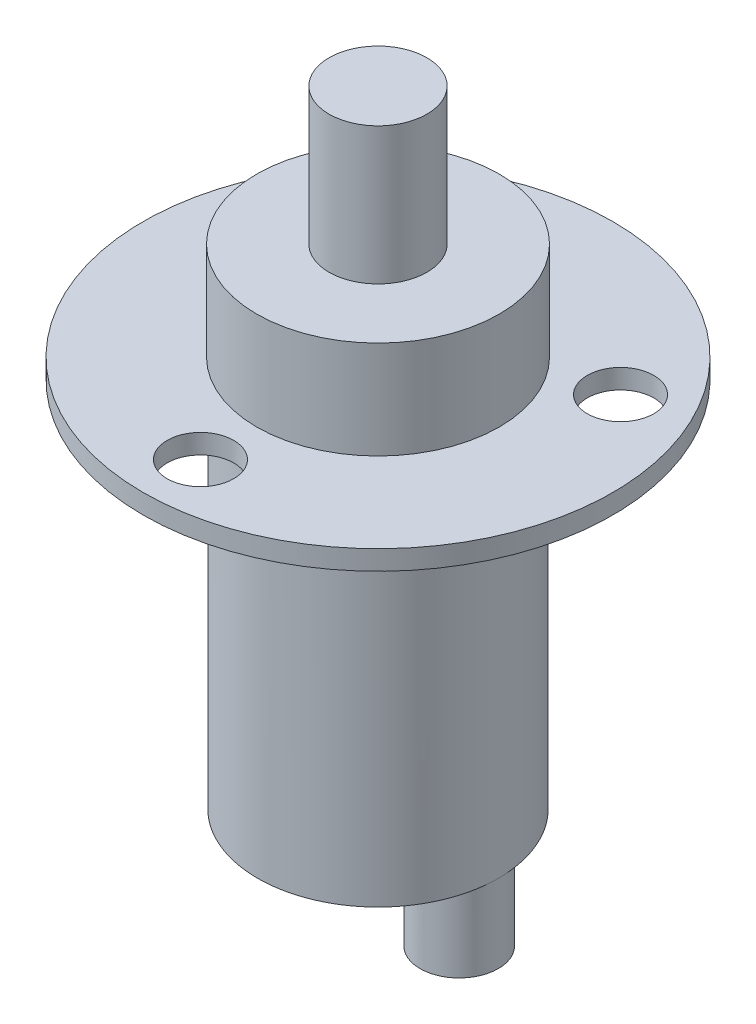
ISO-10303-21;
HEADER;
FILE_DESCRIPTION(('STEP AP214'),'2;1');
FILE_NAME('part.step','',(''),(''),'','','');
FILE_SCHEMA(('AUTOMOTIVE_DESIGN { 1 0 10303 214 1 1 1 1 }'));
ENDSEC;
DATA;
#1=APPLICATION_CONTEXT('core data for automotive mechanical design processes');
#2=APPLICATION_PROTOCOL_DEFINITION('international standard','automotive_design',2000,#1);
#3=PRODUCT_CONTEXT('',#1,'mechanical');
#4=PRODUCT('Part','Part','',(#3));
#5=PRODUCT_RELATED_PRODUCT_CATEGORY('part','',(#4));
#6=PRODUCT_DEFINITION_FORMATION('','',#4);
#7=PRODUCT_DEFINITION_CONTEXT('part definition',#1,'design');
#8=PRODUCT_DEFINITION('design','',#6,#7);
#9=PRODUCT_DEFINITION_SHAPE('','',#8);
#10=(LENGTH_UNIT() NAMED_UNIT(*) SI_UNIT(.MILLI.,.METRE.));
#11=(NAMED_UNIT(*) PLANE_ANGLE_UNIT() SI_UNIT($,.RADIAN.));
#12=(NAMED_UNIT(*) SI_UNIT($,.STERADIAN.) SOLID_ANGLE_UNIT());
#13=UNCERTAINTY_MEASURE_WITH_UNIT(LENGTH_MEASURE(1.E-05),#10,'distance_accuracy_value','');
#14=(GEOMETRIC_REPRESENTATION_CONTEXT(3) GLOBAL_UNCERTAINTY_ASSIGNED_CONTEXT((#13)) GLOBAL_UNIT_ASSIGNED_CONTEXT((#10,
#11,#12)) REPRESENTATION_CONTEXT('',''));
#15=CARTESIAN_POINT('',(0.,0.,0.));
#16=DIRECTION('',(0.,0.,1.));
#17=DIRECTION('',(1.,0.,0.));
#18=AXIS2_PLACEMENT_3D('',#15,#16,#17);
#19=CARTESIAN_POINT('',(0.,19.,0.));
#20=DIRECTION('',(0.,-1.,0.));
#21=DIRECTION('',(0.,0.,-1.));
#22=AXIS2_PLACEMENT_3D('',#19,#20,#21);
#23=CYLINDRICAL_SURFACE('',#22,6.15);
#24=CARTESIAN_POINT('',(0.,19.,0.));
#25=DIRECTION('',(0.,1.,0.));
#26=DIRECTION('',(0.,0.,1.));
#27=AXIS2_PLACEMENT_3D('',#24,#25,#26);
#28=CIRCLE('',#27,6.15);
#29=CARTESIAN_POINT('',(0.,19.,6.15));
#30=VERTEX_POINT('',#29);
#31=EDGE_CURVE('E53',#30,#30,#28,.T.);
#32=ORIENTED_EDGE('',*,*,#31,.F.);
#33=EDGE_LOOP('',(#32));
#34=FACE_BOUND('',#33,.T.);
#35=CARTESIAN_POINT('',(0.,0.,0.));
#36=DIRECTION('',(0.,1.,0.));
#37=DIRECTION('',(0.,0.,1.));
#38=AXIS2_PLACEMENT_3D('',#35,#36,#37);
#39=CIRCLE('',#38,6.15);
#40=CARTESIAN_POINT('',(-6.15,0.,0.));
#41=VERTEX_POINT('',#40);
#42=CARTESIAN_POINT('',(6.15,0.,0.));
#43=VERTEX_POINT('',#42);
#44=EDGE_CURVE('E36',#41,#43,#39,.T.);
#45=ORIENTED_EDGE('',*,*,#44,.T.);
#46=EDGE_CURVE('E48',#43,#41,#39,.T.);
#47=ORIENTED_EDGE('',*,*,#46,.T.);
#48=EDGE_LOOP('',(#45,#47));
#49=FACE_BOUND('',#48,.T.);
#50=ADVANCED_FACE('F33',(#34,#49),#23,.T.);
#51=CARTESIAN_POINT('',(0.,0.,0.));
#52=DIRECTION('',(0.,1.,0.));
#53=DIRECTION('',(0.,0.,1.));
#54=AXIS2_PLACEMENT_3D('',#51,#52,#53);
#55=PLANE('',#54);
#56=ORIENTED_EDGE('',*,*,#46,.F.);
#57=CARTESIAN_POINT('',(4.15,0.,0.));
#58=DIRECTION('',(0.,-1.,0.));
#59=DIRECTION('',(0.,0.,-1.));
#60=AXIS2_PLACEMENT_3D('',#57,#58,#59);
#61=CIRCLE('',#60,2.);
#62=EDGE_CURVE('E56',#43,#43,#61,.T.);
#63=ORIENTED_EDGE('',*,*,#62,.F.);
#64=ORIENTED_EDGE('',*,*,#44,.F.);
#65=CARTESIAN_POINT('',(-4.15,0.,0.));
#66=DIRECTION('',(0.,-1.,0.));
#67=DIRECTION('',(0.,0.,-1.));
#68=AXIS2_PLACEMENT_3D('',#65,#66,#67);
#69=CIRCLE('',#68,2.);
#70=EDGE_CURVE('E58',#41,#41,#69,.T.);
#71=ORIENTED_EDGE('',*,*,#70,.F.);
#72=EDGE_LOOP('',(#56,#63,#64,#71));
#73=FACE_BOUND('',#72,.T.);
#74=ADVANCED_FACE('F54',(#73),#55,.F.);
#75=CARTESIAN_POINT('',(0.,20.,0.));
#76=DIRECTION('',(0.,-1.,0.));
#77=DIRECTION('',(0.,0.,-1.));
#78=AXIS2_PLACEMENT_3D('',#75,#76,#77);
#79=CYLINDRICAL_SURFACE('',#78,12.);
#80=CARTESIAN_POINT('',(0.,20.,0.));
#81=DIRECTION('',(0.,1.,0.));
#82=DIRECTION('',(0.,0.,1.));
#83=AXIS2_PLACEMENT_3D('',#80,#81,#82);
#84=CIRCLE('',#83,12.);
#85=CARTESIAN_POINT('',(0.,20.,12.));
#86=VERTEX_POINT('',#85);
#87=EDGE_CURVE('E59',#86,#86,#84,.T.);
#88=ORIENTED_EDGE('',*,*,#87,.F.);
#89=EDGE_LOOP('',(#88));
#90=FACE_BOUND('',#89,.T.);
#91=CARTESIAN_POINT('',(0.,19.,0.));
#92=DIRECTION('',(0.,1.,0.));
#93=DIRECTION('',(0.,0.,1.));
#94=AXIS2_PLACEMENT_3D('',#91,#92,#93);
#95=CIRCLE('',#94,12.);
#96=CARTESIAN_POINT('',(0.,19.,12.));
#97=VERTEX_POINT('',#96);
#98=EDGE_CURVE('E61',#97,#97,#95,.T.);
#99=ORIENTED_EDGE('',*,*,#98,.T.);
#100=EDGE_LOOP('',(#99));
#101=FACE_BOUND('',#100,.T.);
#102=ADVANCED_FACE('F81',(#90,#101),#79,.T.);
#103=CARTESIAN_POINT('',(0.,20.,0.));
#104=DIRECTION('',(0.,1.,0.));
#105=DIRECTION('',(0.,0.,1.));
#106=AXIS2_PLACEMENT_3D('',#103,#104,#105);
#107=PLANE('',#106);
#108=CARTESIAN_POINT('',(0.,20.,9.075));
#109=DIRECTION('',(0.,1.,0.));
#110=DIRECTION('',(0.,0.,1.));
#111=AXIS2_PLACEMENT_3D('',#108,#109,#110);
#112=CIRCLE('',#111,1.7);
#113=CARTESIAN_POINT('',(0.,20.,10.775));
#114=VERTEX_POINT('',#113);
#115=EDGE_CURVE('E208',#114,#114,#112,.T.);
#116=ORIENTED_EDGE('',*,*,#115,.F.);
#117=EDGE_LOOP('',(#116));
#118=FACE_BOUND('',#117,.T.);
#119=CARTESIAN_POINT('',(7.85918053934436,20.,-4.53749999999967));
#120=DIRECTION('',(0.,1.,0.));
#121=DIRECTION('',(0.,0.,1.));
#122=AXIS2_PLACEMENT_3D('',#119,#120,#121);
#123=CIRCLE('',#122,1.7000000000005);
#124=CARTESIAN_POINT('',(7.85918053934436,20.,-2.83749999999917));
#125=VERTEX_POINT('',#124);
#126=EDGE_CURVE('E212',#125,#125,#123,.T.);
#127=ORIENTED_EDGE('',*,*,#126,.F.);
#128=EDGE_LOOP('',(#127));
#129=FACE_BOUND('',#128,.T.);
#130=CARTESIAN_POINT('',(-7.8591805393432,20.,-4.53750000000034));
#131=DIRECTION('',(0.,1.,0.));
#132=DIRECTION('',(0.,0.,1.));
#133=AXIS2_PLACEMENT_3D('',#130,#131,#132);
#134=CIRCLE('',#133,1.70000000000073);
#135=CARTESIAN_POINT('',(-7.8591805393432,20.,-2.8374999999996));
#136=VERTEX_POINT('',#135);
#137=EDGE_CURVE('E215',#136,#136,#134,.T.);
#138=ORIENTED_EDGE('',*,*,#137,.F.);
#139=EDGE_LOOP('',(#138));
#140=FACE_BOUND('',#139,.T.);
#141=CARTESIAN_POINT('',(0.,20.,0.));
#142=DIRECTION('',(0.,1.,0.));
#143=DIRECTION('',(0.,0.,1.));
#144=AXIS2_PLACEMENT_3D('',#141,#142,#143);
#145=CIRCLE('',#144,6.2);
#146=CARTESIAN_POINT('',(0.,20.,6.2));
#147=VERTEX_POINT('',#146);
#148=EDGE_CURVE('E41',#147,#147,#145,.T.);
#149=ORIENTED_EDGE('',*,*,#148,.F.);
#150=EDGE_LOOP('',(#149));
#151=FACE_BOUND('',#150,.T.);
#152=ORIENTED_EDGE('',*,*,#87,.T.);
#153=EDGE_LOOP('',(#152));
#154=FACE_BOUND('',#153,.T.);
#155=ADVANCED_FACE('F78',(#118,#129,#140,#151,#154),#107,.T.);
#156=CARTESIAN_POINT('',(0.,19.,0.));
#157=DIRECTION('',(0.,1.,0.));
#158=DIRECTION('',(0.,0.,1.));
#159=AXIS2_PLACEMENT_3D('',#156,#157,#158);
#160=PLANE('',#159);
#161=CARTESIAN_POINT('',(0.,19.,9.075));
#162=DIRECTION('',(0.,-1.,0.));
#163=DIRECTION('',(0.,0.,-1.));
#164=AXIS2_PLACEMENT_3D('',#161,#162,#163);
#165=CIRCLE('',#164,1.7);
#166=CARTESIAN_POINT('',(0.,19.,7.375));
#167=VERTEX_POINT('',#166);
#168=EDGE_CURVE('E218',#167,#167,#165,.T.);
#169=ORIENTED_EDGE('',*,*,#168,.F.);
#170=EDGE_LOOP('',(#169));
#171=FACE_BOUND('',#170,.T.);
#172=CARTESIAN_POINT('',(7.85918053934436,19.,-4.53749999999967));
#173=DIRECTION('',(0.,-1.,0.));
#174=DIRECTION('',(0.,0.,-1.));
#175=AXIS2_PLACEMENT_3D('',#172,#173,#174);
#176=CIRCLE('',#175,1.7000000000005);
#177=CARTESIAN_POINT('',(7.85918053934436,19.,-6.23750000000017));
#178=VERTEX_POINT('',#177);
#179=EDGE_CURVE('E222',#178,#178,#176,.T.);
#180=ORIENTED_EDGE('',*,*,#179,.F.);
#181=EDGE_LOOP('',(#180));
#182=FACE_BOUND('',#181,.T.);
#183=CARTESIAN_POINT('',(-7.8591805393432,19.,-4.53750000000034));
#184=DIRECTION('',(0.,-1.,0.));
#185=DIRECTION('',(0.,0.,-1.));
#186=AXIS2_PLACEMENT_3D('',#183,#184,#185);
#187=CIRCLE('',#186,1.70000000000073);
#188=CARTESIAN_POINT('',(-7.8591805393432,19.,-6.23750000000107));
#189=VERTEX_POINT('',#188);
#190=EDGE_CURVE('E219',#189,#189,#187,.T.);
#191=ORIENTED_EDGE('',*,*,#190,.F.);
#192=EDGE_LOOP('',(#191));
#193=FACE_BOUND('',#192,.T.);
#194=ORIENTED_EDGE('',*,*,#31,.T.);
#195=EDGE_LOOP('',(#194));
#196=FACE_BOUND('',#195,.T.);
#197=ORIENTED_EDGE('',*,*,#98,.F.);
#198=EDGE_LOOP('',(#197));
#199=FACE_BOUND('',#198,.T.);
#200=ADVANCED_FACE('F80',(#171,#182,#193,#196,#199),#160,.F.);
#201=CARTESIAN_POINT('',(0.,25.,0.));
#202=DIRECTION('',(0.,-1.,0.));
#203=DIRECTION('',(0.,0.,-1.));
#204=AXIS2_PLACEMENT_3D('',#201,#202,#203);
#205=CYLINDRICAL_SURFACE('',#204,6.2);
#206=CARTESIAN_POINT('',(0.,25.,0.));
#207=DIRECTION('',(0.,1.,0.));
#208=DIRECTION('',(0.,0.,1.));
#209=AXIS2_PLACEMENT_3D('',#206,#207,#208);
#210=CIRCLE('',#209,6.2);
#211=CARTESIAN_POINT('',(0.,25.,6.2));
#212=VERTEX_POINT('',#211);
#213=EDGE_CURVE('E66',#212,#212,#210,.T.);
#214=ORIENTED_EDGE('',*,*,#213,.F.);
#215=EDGE_LOOP('',(#214));
#216=FACE_BOUND('',#215,.T.);
#217=ORIENTED_EDGE('',*,*,#148,.T.);
#218=EDGE_LOOP('',(#217));
#219=FACE_BOUND('',#218,.T.);
#220=ADVANCED_FACE('F76',(#216,#219),#205,.T.);
#221=CARTESIAN_POINT('',(0.,25.,0.));
#222=DIRECTION('',(0.,1.,0.));
#223=DIRECTION('',(0.,0.,1.));
#224=AXIS2_PLACEMENT_3D('',#221,#222,#223);
#225=PLANE('',#224);
#226=CARTESIAN_POINT('',(0.,25.,0.));
#227=DIRECTION('',(0.,1.,0.));
#228=DIRECTION('',(0.,0.,1.));
#229=AXIS2_PLACEMENT_3D('',#226,#227,#228);
#230=CIRCLE('',#229,2.5);
#231=CARTESIAN_POINT('',(0.,25.,2.5));
#232=VERTEX_POINT('',#231);
#233=EDGE_CURVE('E11',#232,#232,#230,.T.);
#234=ORIENTED_EDGE('',*,*,#233,.F.);
#235=EDGE_LOOP('',(#234));
#236=FACE_BOUND('',#235,.T.);
#237=ORIENTED_EDGE('',*,*,#213,.T.);
#238=EDGE_LOOP('',(#237));
#239=FACE_BOUND('',#238,.T.);
#240=ADVANCED_FACE('F186',(#236,#239),#225,.T.);
#241=CARTESIAN_POINT('',(0.,32.,0.));
#242=DIRECTION('',(0.,-1.,0.));
#243=DIRECTION('',(0.,0.,-1.));
#244=AXIS2_PLACEMENT_3D('',#241,#242,#243);
#245=CYLINDRICAL_SURFACE('',#244,2.5);
#246=CARTESIAN_POINT('',(0.,32.,0.));
#247=DIRECTION('',(0.,1.,0.));
#248=DIRECTION('',(0.,0.,1.));
#249=AXIS2_PLACEMENT_3D('',#246,#247,#248);
#250=CIRCLE('',#249,2.5);
#251=CARTESIAN_POINT('',(0.,32.,2.5));
#252=VERTEX_POINT('',#251);
#253=EDGE_CURVE('E198',#252,#252,#250,.T.);
#254=ORIENTED_EDGE('',*,*,#253,.F.);
#255=EDGE_LOOP('',(#254));
#256=FACE_BOUND('',#255,.T.);
#257=ORIENTED_EDGE('',*,*,#233,.T.);
#258=EDGE_LOOP('',(#257));
#259=FACE_BOUND('',#258,.T.);
#260=ADVANCED_FACE('F182',(#256,#259),#245,.T.);
#261=CARTESIAN_POINT('',(0.,32.,0.));
#262=DIRECTION('',(0.,1.,0.));
#263=DIRECTION('',(0.,0.,1.));
#264=AXIS2_PLACEMENT_3D('',#261,#262,#263);
#265=PLANE('',#264);
#266=ORIENTED_EDGE('',*,*,#253,.T.);
#267=EDGE_LOOP('',(#266));
#268=FACE_BOUND('',#267,.T.);
#269=ADVANCED_FACE('F113',(#268),#265,.T.);
#270=CARTESIAN_POINT('',(-4.15,-4.,0.));
#271=DIRECTION('',(0.,1.,0.));
#272=DIRECTION('',(0.,0.,1.));
#273=AXIS2_PLACEMENT_3D('',#270,#271,#272);
#274=CYLINDRICAL_SURFACE('',#273,2.);
#275=CARTESIAN_POINT('',(-4.15,-4.,0.));
#276=DIRECTION('',(0.,-1.,0.));
#277=DIRECTION('',(0.,0.,-1.));
#278=AXIS2_PLACEMENT_3D('',#275,#276,#277);
#279=CIRCLE('',#278,2.);
#280=CARTESIAN_POINT('',(-4.15,-4.,-2.));
#281=VERTEX_POINT('',#280);
#282=EDGE_CURVE('E200',#281,#281,#279,.T.);
#283=ORIENTED_EDGE('',*,*,#282,.F.);
#284=EDGE_LOOP('',(#283));
#285=FACE_BOUND('',#284,.T.);
#286=ORIENTED_EDGE('',*,*,#70,.T.);
#287=EDGE_LOOP('',(#286));
#288=FACE_BOUND('',#287,.T.);
#289=ADVANCED_FACE('F107',(#285,#288),#274,.T.);
#290=CARTESIAN_POINT('',(-4.15,-4.,0.));
#291=DIRECTION('',(0.,-1.,0.));
#292=DIRECTION('',(0.,0.,-1.));
#293=AXIS2_PLACEMENT_3D('',#290,#291,#292);
#294=PLANE('',#293);
#295=ORIENTED_EDGE('',*,*,#282,.T.);
#296=EDGE_LOOP('',(#295));
#297=FACE_BOUND('',#296,.T.);
#298=ADVANCED_FACE('F112',(#297),#294,.T.);
#299=CARTESIAN_POINT('',(4.15,-4.,0.));
#300=DIRECTION('',(0.,1.,0.));
#301=DIRECTION('',(0.,0.,1.));
#302=AXIS2_PLACEMENT_3D('',#299,#300,#301);
#303=CYLINDRICAL_SURFACE('',#302,2.);
#304=CARTESIAN_POINT('',(4.15,-4.,0.));
#305=DIRECTION('',(0.,-1.,0.));
#306=DIRECTION('',(0.,0.,-1.));
#307=AXIS2_PLACEMENT_3D('',#304,#305,#306);
#308=CIRCLE('',#307,2.);
#309=CARTESIAN_POINT('',(4.15,-4.,-2.));
#310=VERTEX_POINT('',#309);
#311=EDGE_CURVE('E204',#310,#310,#308,.T.);
#312=ORIENTED_EDGE('',*,*,#311,.F.);
#313=EDGE_LOOP('',(#312));
#314=FACE_BOUND('',#313,.T.);
#315=ORIENTED_EDGE('',*,*,#62,.T.);
#316=EDGE_LOOP('',(#315));
#317=FACE_BOUND('',#316,.T.);
#318=ADVANCED_FACE('F125',(#314,#317),#303,.T.);
#319=CARTESIAN_POINT('',(4.15,-4.,0.));
#320=DIRECTION('',(0.,-1.,0.));
#321=DIRECTION('',(0.,0.,-1.));
#322=AXIS2_PLACEMENT_3D('',#319,#320,#321);
#323=PLANE('',#322);
#324=ORIENTED_EDGE('',*,*,#311,.T.);
#325=EDGE_LOOP('',(#324));
#326=FACE_BOUND('',#325,.T.);
#327=ADVANCED_FACE('F134',(#326),#323,.T.);
#328=CARTESIAN_POINT('',(-7.8591805393432,32.,-4.53750000000034));
#329=DIRECTION('',(0.,-1.,0.));
#330=DIRECTION('',(0.,0.,-1.));
#331=AXIS2_PLACEMENT_3D('',#328,#329,#330);
#332=CYLINDRICAL_SURFACE('',#331,1.70000000000073);
#333=ORIENTED_EDGE('',*,*,#137,.T.);
#334=EDGE_LOOP('',(#333));
#335=FACE_BOUND('',#334,.T.);
#336=ORIENTED_EDGE('',*,*,#190,.T.);
#337=EDGE_LOOP('',(#336));
#338=FACE_BOUND('',#337,.T.);
#339=ADVANCED_FACE('F143',(#335,#338),#332,.F.);
#340=CARTESIAN_POINT('',(7.85918053934436,32.,-4.53749999999967));
#341=DIRECTION('',(0.,-1.,0.));
#342=DIRECTION('',(0.,0.,-1.));
#343=AXIS2_PLACEMENT_3D('',#340,#341,#342);
#344=CYLINDRICAL_SURFACE('',#343,1.7000000000005);
#345=ORIENTED_EDGE('',*,*,#126,.T.);
#346=EDGE_LOOP('',(#345));
#347=FACE_BOUND('',#346,.T.);
#348=ORIENTED_EDGE('',*,*,#179,.T.);
#349=EDGE_LOOP('',(#348));
#350=FACE_BOUND('',#349,.T.);
#351=ADVANCED_FACE('F154',(#347,#350),#344,.F.);
#352=CARTESIAN_POINT('',(0.,32.,9.075));
#353=DIRECTION('',(0.,-1.,0.));
#354=DIRECTION('',(0.,0.,-1.));
#355=AXIS2_PLACEMENT_3D('',#352,#353,#354);
#356=CYLINDRICAL_SURFACE('',#355,1.7);
#357=ORIENTED_EDGE('',*,*,#115,.T.);
#358=EDGE_LOOP('',(#357));
#359=FACE_BOUND('',#358,.T.);
#360=ORIENTED_EDGE('',*,*,#168,.T.);
#361=EDGE_LOOP('',(#360));
#362=FACE_BOUND('',#361,.T.);
#363=ADVANCED_FACE('F161',(#359,#362),#356,.F.);
#364=CLOSED_SHELL('',(#50,#74,#102,#155,#200,#220,#240,#260,#269,#289,#298,#318,#327,#339,#351,#363));
#365=MANIFOLD_SOLID_BREP('B2',#364);
#366=ADVANCED_BREP_SHAPE_REPRESENTATION('',(#18,#365),#14);
#367=SHAPE_DEFINITION_REPRESENTATION(#9,#366);
ENDSEC;
END-ISO-10303-21;
